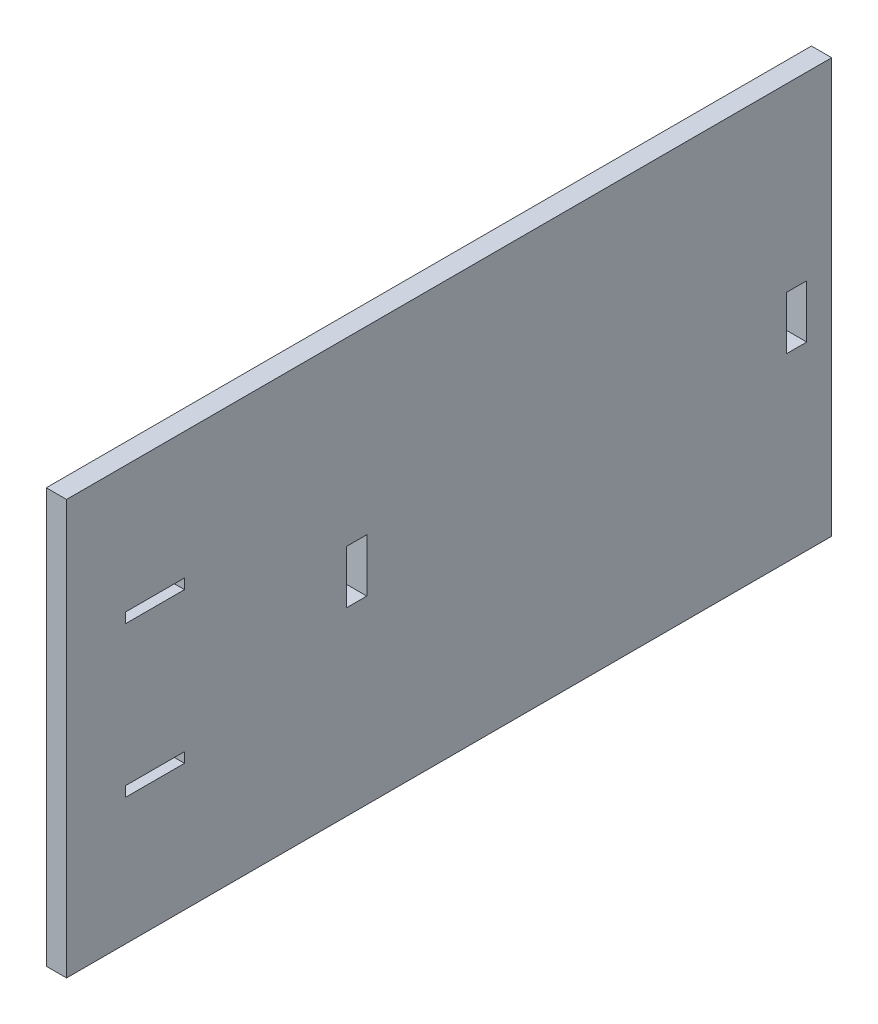
ISO-10303-21;
HEADER;
FILE_DESCRIPTION(('STEP AP214'),'2;1');
FILE_NAME('part.step','',(''),(''),'','','');
FILE_SCHEMA(('AUTOMOTIVE_DESIGN { 1 0 10303 214 1 1 1 1 }'));
ENDSEC;
DATA;
#1=APPLICATION_CONTEXT('core data for automotive mechanical design processes');
#2=APPLICATION_PROTOCOL_DEFINITION('international standard','automotive_design',2000,#1);
#3=PRODUCT_CONTEXT('',#1,'mechanical');
#4=PRODUCT('Part','Part','',(#3));
#5=PRODUCT_RELATED_PRODUCT_CATEGORY('part','',(#4));
#6=PRODUCT_DEFINITION_FORMATION('','',#4);
#7=PRODUCT_DEFINITION_CONTEXT('part definition',#1,'design');
#8=PRODUCT_DEFINITION('design','',#6,#7);
#9=PRODUCT_DEFINITION_SHAPE('','',#8);
#10=(LENGTH_UNIT() NAMED_UNIT(*) SI_UNIT(.MILLI.,.METRE.));
#11=(NAMED_UNIT(*) PLANE_ANGLE_UNIT() SI_UNIT($,.RADIAN.));
#12=(NAMED_UNIT(*) SI_UNIT($,.STERADIAN.) SOLID_ANGLE_UNIT());
#13=UNCERTAINTY_MEASURE_WITH_UNIT(LENGTH_MEASURE(1.E-05),#10,'distance_accuracy_value','');
#14=(GEOMETRIC_REPRESENTATION_CONTEXT(3) GLOBAL_UNCERTAINTY_ASSIGNED_CONTEXT((#13)) GLOBAL_UNIT_ASSIGNED_CONTEXT((#10,
#11,#12)) REPRESENTATION_CONTEXT('',''));
#15=CARTESIAN_POINT('',(0.,0.,0.));
#16=DIRECTION('',(0.,0.,1.));
#17=DIRECTION('',(1.,0.,0.));
#18=AXIS2_PLACEMENT_3D('',#15,#16,#17);
#19=CARTESIAN_POINT('',(6.35,0.,0.));
#20=DIRECTION('',(-1.,0.,0.));
#21=DIRECTION('',(0.,0.,1.));
#22=AXIS2_PLACEMENT_3D('',#19,#20,#21);
#23=PLANE('',#22);
#24=DIRECTION('',(0.,1.,0.));
#25=VECTOR('',#24,1.);
#26=CARTESIAN_POINT('',(6.35,73.3366666666667,-232.175));
#27=LINE('',#26,#25);
#28=CARTESIAN_POINT('',(6.35,56.67,-232.175));
#29=VERTEX_POINT('',#28);
#30=CARTESIAN_POINT('',(6.35,73.3366666666667,-232.175));
#31=VERTEX_POINT('',#30);
#32=EDGE_CURVE('E206',#29,#31,#27,.T.);
#33=ORIENTED_EDGE('',*,*,#32,.F.);
#34=DIRECTION('',(0.,0.,-1.));
#35=VECTOR('',#34,1.);
#36=CARTESIAN_POINT('',(6.35,56.67,-232.175));
#37=LINE('',#36,#35);
#38=CARTESIAN_POINT('',(6.35,56.67,-225.825));
#39=VERTEX_POINT('',#38);
#40=EDGE_CURVE('E214',#39,#29,#37,.T.);
#41=ORIENTED_EDGE('',*,*,#40,.F.);
#42=DIRECTION('',(0.,-1.,0.));
#43=VECTOR('',#42,1.);
#44=CARTESIAN_POINT('',(6.35,73.3366666666667,-225.825));
#45=LINE('',#44,#43);
#46=CARTESIAN_POINT('',(6.35,73.3366666666667,-225.825));
#47=VERTEX_POINT('',#46);
#48=EDGE_CURVE('E211',#47,#39,#45,.T.);
#49=ORIENTED_EDGE('',*,*,#48,.F.);
#50=DIRECTION('',(0.,0.,1.));
#51=VECTOR('',#50,1.);
#52=CARTESIAN_POINT('',(6.35,73.3366666666667,-232.175));
#53=LINE('',#52,#51);
#54=EDGE_CURVE('E208',#31,#47,#53,.T.);
#55=ORIENTED_EDGE('',*,*,#54,.F.);
#56=EDGE_LOOP('',(#33,#41,#49,#55));
#57=FACE_BOUND('',#56,.T.);
#58=DIRECTION('',(0.,1.,0.));
#59=VECTOR('',#58,1.);
#60=CARTESIAN_POINT('',(6.35,73.33,-94.1749999999999));
#61=LINE('',#60,#59);
#62=CARTESIAN_POINT('',(6.35,56.6633333333333,-94.1749999999999));
#63=VERTEX_POINT('',#62);
#64=CARTESIAN_POINT('',(6.35,73.33,-94.1749999999999));
#65=VERTEX_POINT('',#64);
#66=EDGE_CURVE('E268',#63,#65,#61,.T.);
#67=ORIENTED_EDGE('',*,*,#66,.F.);
#68=DIRECTION('',(0.,0.,-1.));
#69=VECTOR('',#68,1.);
#70=CARTESIAN_POINT('',(6.35,56.6633333333333,-94.1749999999999));
#71=LINE('',#70,#69);
#72=CARTESIAN_POINT('',(6.35,56.6633333333333,-87.8249999999999));
#73=VERTEX_POINT('',#72);
#74=EDGE_CURVE('E276',#73,#63,#71,.T.);
#75=ORIENTED_EDGE('',*,*,#74,.F.);
#76=DIRECTION('',(0.,-1.,0.));
#77=VECTOR('',#76,1.);
#78=CARTESIAN_POINT('',(6.35,73.33,-87.8249999999999));
#79=LINE('',#78,#77);
#80=CARTESIAN_POINT('',(6.35,73.33,-87.8249999999999));
#81=VERTEX_POINT('',#80);
#82=EDGE_CURVE('E273',#81,#73,#79,.T.);
#83=ORIENTED_EDGE('',*,*,#82,.F.);
#84=DIRECTION('',(0.,0.,1.));
#85=VECTOR('',#84,1.);
#86=CARTESIAN_POINT('',(6.35,73.33,-94.1749999999999));
#87=LINE('',#86,#85);
#88=EDGE_CURVE('E270',#65,#81,#87,.T.);
#89=ORIENTED_EDGE('',*,*,#88,.F.);
#90=EDGE_LOOP('',(#67,#75,#83,#89));
#91=FACE_BOUND('',#90,.T.);
#92=DIRECTION('',(0.,-1.,0.));
#93=VECTOR('',#92,1.);
#94=CARTESIAN_POINT('',(6.35,0.,0.));
#95=LINE('',#94,#93);
#96=CARTESIAN_POINT('',(6.35,130.,0.));
#97=VERTEX_POINT('',#96);
#98=CARTESIAN_POINT('',(6.35,0.,0.));
#99=VERTEX_POINT('',#98);
#100=EDGE_CURVE('E299',#97,#99,#95,.T.);
#101=ORIENTED_EDGE('',*,*,#100,.T.);
#102=DIRECTION('',(0.,0.,-1.));
#103=VECTOR('',#102,1.);
#104=CARTESIAN_POINT('',(6.35,0.,0.));
#105=LINE('',#104,#103);
#106=CARTESIAN_POINT('',(6.35,0.,-240.));
#107=VERTEX_POINT('',#106);
#108=EDGE_CURVE('E302',#99,#107,#105,.T.);
#109=ORIENTED_EDGE('',*,*,#108,.T.);
#110=DIRECTION('',(0.,1.,0.));
#111=VECTOR('',#110,1.);
#112=CARTESIAN_POINT('',(6.35,0.,-240.));
#113=LINE('',#112,#111);
#114=CARTESIAN_POINT('',(6.35,130.,-240.));
#115=VERTEX_POINT('',#114);
#116=EDGE_CURVE('E305',#107,#115,#113,.T.);
#117=ORIENTED_EDGE('',*,*,#116,.T.);
#118=DIRECTION('',(0.,0.,1.));
#119=VECTOR('',#118,1.);
#120=CARTESIAN_POINT('',(6.35,130.,0.));
#121=LINE('',#120,#119);
#122=EDGE_CURVE('E307',#115,#97,#121,.T.);
#123=ORIENTED_EDGE('',*,*,#122,.T.);
#124=EDGE_LOOP('',(#101,#109,#117,#123));
#125=FACE_BOUND('',#124,.T.);
#126=DIRECTION('',(0.,1.,0.));
#127=VECTOR('',#126,1.);
#128=CARTESIAN_POINT('',(6.35,87.,-37.));
#129=LINE('',#128,#127);
#130=CARTESIAN_POINT('',(6.35,87.,-37.));
#131=VERTEX_POINT('',#130);
#132=CARTESIAN_POINT('',(6.35,90.175,-37.));
#133=VERTEX_POINT('',#132);
#134=EDGE_CURVE('E237',#131,#133,#129,.T.);
#135=ORIENTED_EDGE('',*,*,#134,.F.);
#136=DIRECTION('',(0.,0.,-1.));
#137=VECTOR('',#136,1.);
#138=CARTESIAN_POINT('',(6.35,87.,-37.));
#139=LINE('',#138,#137);
#140=CARTESIAN_POINT('',(6.35,87.,-18.5));
#141=VERTEX_POINT('',#140);
#142=EDGE_CURVE('E245',#141,#131,#139,.T.);
#143=ORIENTED_EDGE('',*,*,#142,.F.);
#144=DIRECTION('',(0.,-1.,0.));
#145=VECTOR('',#144,1.);
#146=CARTESIAN_POINT('',(6.35,87.,-18.5));
#147=LINE('',#146,#145);
#148=CARTESIAN_POINT('',(6.35,90.175,-18.5));
#149=VERTEX_POINT('',#148);
#150=EDGE_CURVE('E242',#149,#141,#147,.T.);
#151=ORIENTED_EDGE('',*,*,#150,.F.);
#152=DIRECTION('',(0.,0.,1.));
#153=VECTOR('',#152,1.);
#154=CARTESIAN_POINT('',(6.35,90.175,-37.));
#155=LINE('',#154,#153);
#156=EDGE_CURVE('E239',#133,#149,#155,.T.);
#157=ORIENTED_EDGE('',*,*,#156,.F.);
#158=EDGE_LOOP('',(#135,#143,#151,#157));
#159=FACE_BOUND('',#158,.T.);
#160=DIRECTION('',(0.,1.,0.));
#161=VECTOR('',#160,1.);
#162=CARTESIAN_POINT('',(6.35,43.,-37.));
#163=LINE('',#162,#161);
#164=CARTESIAN_POINT('',(6.35,39.825,-37.));
#165=VERTEX_POINT('',#164);
#166=CARTESIAN_POINT('',(6.35,43.,-37.));
#167=VERTEX_POINT('',#166);
#168=EDGE_CURVE('E170',#165,#167,#163,.T.);
#169=ORIENTED_EDGE('',*,*,#168,.F.);
#170=DIRECTION('',(0.,0.,-1.));
#171=VECTOR('',#170,1.);
#172=CARTESIAN_POINT('',(6.35,39.825,-37.));
#173=LINE('',#172,#171);
#174=CARTESIAN_POINT('',(6.35,39.825,-18.5));
#175=VERTEX_POINT('',#174);
#176=EDGE_CURVE('E192',#175,#165,#173,.T.);
#177=ORIENTED_EDGE('',*,*,#176,.F.);
#178=DIRECTION('',(0.,-1.,0.));
#179=VECTOR('',#178,1.);
#180=CARTESIAN_POINT('',(6.35,43.,-18.5));
#181=LINE('',#180,#179);
#182=CARTESIAN_POINT('',(6.35,43.,-18.5));
#183=VERTEX_POINT('',#182);
#184=EDGE_CURVE('E190',#183,#175,#181,.T.);
#185=ORIENTED_EDGE('',*,*,#184,.F.);
#186=DIRECTION('',(0.,0.,1.));
#187=VECTOR('',#186,1.);
#188=CARTESIAN_POINT('',(6.35,43.,-37.));
#189=LINE('',#188,#187);
#190=EDGE_CURVE('E178',#167,#183,#189,.T.);
#191=ORIENTED_EDGE('',*,*,#190,.F.);
#192=EDGE_LOOP('',(#169,#177,#185,#191));
#193=FACE_BOUND('',#192,.T.);
#194=ADVANCED_FACE('F33',(#57,#91,#125,#159,#193),#23,.F.);
#195=CARTESIAN_POINT('',(0.,0.,0.));
#196=DIRECTION('',(-1.,0.,0.));
#197=DIRECTION('',(0.,0.,1.));
#198=AXIS2_PLACEMENT_3D('',#195,#196,#197);
#199=PLANE('',#198);
#200=DIRECTION('',(0.,-1.,0.));
#201=VECTOR('',#200,1.);
#202=CARTESIAN_POINT('',(0.,0.,0.));
#203=LINE('',#202,#201);
#204=CARTESIAN_POINT('',(0.,130.,0.));
#205=VERTEX_POINT('',#204);
#206=CARTESIAN_POINT('',(0.,0.,0.));
#207=VERTEX_POINT('',#206);
#208=EDGE_CURVE('E298',#205,#207,#203,.T.);
#209=ORIENTED_EDGE('',*,*,#208,.F.);
#210=DIRECTION('',(0.,0.,1.));
#211=VECTOR('',#210,1.);
#212=CARTESIAN_POINT('',(0.,130.,0.));
#213=LINE('',#212,#211);
#214=CARTESIAN_POINT('',(0.,130.,-240.));
#215=VERTEX_POINT('',#214);
#216=EDGE_CURVE('E303',#215,#205,#213,.T.);
#217=ORIENTED_EDGE('',*,*,#216,.F.);
#218=DIRECTION('',(0.,1.,0.));
#219=VECTOR('',#218,1.);
#220=CARTESIAN_POINT('',(0.,0.,-240.));
#221=LINE('',#220,#219);
#222=CARTESIAN_POINT('',(0.,0.,-240.));
#223=VERTEX_POINT('',#222);
#224=EDGE_CURVE('E314',#223,#215,#221,.T.);
#225=ORIENTED_EDGE('',*,*,#224,.F.);
#226=DIRECTION('',(0.,0.,-1.));
#227=VECTOR('',#226,1.);
#228=CARTESIAN_POINT('',(0.,0.,0.));
#229=LINE('',#228,#227);
#230=EDGE_CURVE('E312',#207,#223,#229,.T.);
#231=ORIENTED_EDGE('',*,*,#230,.F.);
#232=EDGE_LOOP('',(#209,#217,#225,#231));
#233=FACE_BOUND('',#232,.T.);
#234=DIRECTION('',(0.,0.,-1.));
#235=VECTOR('',#234,1.);
#236=CARTESIAN_POINT('',(0.,56.6633333333333,-94.1749999999999));
#237=LINE('',#236,#235);
#238=CARTESIAN_POINT('',(0.,56.6633333333333,-87.8249999999999));
#239=VERTEX_POINT('',#238);
#240=CARTESIAN_POINT('',(0.,56.6633333333333,-94.1749999999999));
#241=VERTEX_POINT('',#240);
#242=EDGE_CURVE('E271',#239,#241,#237,.T.);
#243=ORIENTED_EDGE('',*,*,#242,.T.);
#244=DIRECTION('',(0.,1.,0.));
#245=VECTOR('',#244,1.);
#246=CARTESIAN_POINT('',(0.,73.33,-94.1749999999999));
#247=LINE('',#246,#245);
#248=CARTESIAN_POINT('',(0.,73.33,-94.1749999999999));
#249=VERTEX_POINT('',#248);
#250=EDGE_CURVE('E267',#241,#249,#247,.T.);
#251=ORIENTED_EDGE('',*,*,#250,.T.);
#252=DIRECTION('',(0.,0.,1.));
#253=VECTOR('',#252,1.);
#254=CARTESIAN_POINT('',(0.,73.33,-94.1749999999999));
#255=LINE('',#254,#253);
#256=CARTESIAN_POINT('',(0.,73.33,-87.8249999999999));
#257=VERTEX_POINT('',#256);
#258=EDGE_CURVE('E281',#249,#257,#255,.T.);
#259=ORIENTED_EDGE('',*,*,#258,.T.);
#260=DIRECTION('',(0.,-1.,0.));
#261=VECTOR('',#260,1.);
#262=CARTESIAN_POINT('',(0.,73.33,-87.8249999999999));
#263=LINE('',#262,#261);
#264=EDGE_CURVE('E284',#257,#239,#263,.T.);
#265=ORIENTED_EDGE('',*,*,#264,.T.);
#266=EDGE_LOOP('',(#243,#251,#259,#265));
#267=FACE_BOUND('',#266,.T.);
#268=DIRECTION('',(0.,0.,-1.));
#269=VECTOR('',#268,1.);
#270=CARTESIAN_POINT('',(0.,87.,-37.));
#271=LINE('',#270,#269);
#272=CARTESIAN_POINT('',(0.,87.,-18.5));
#273=VERTEX_POINT('',#272);
#274=CARTESIAN_POINT('',(0.,87.,-37.));
#275=VERTEX_POINT('',#274);
#276=EDGE_CURVE('E240',#273,#275,#271,.T.);
#277=ORIENTED_EDGE('',*,*,#276,.T.);
#278=DIRECTION('',(0.,1.,0.));
#279=VECTOR('',#278,1.);
#280=CARTESIAN_POINT('',(0.,87.,-37.));
#281=LINE('',#280,#279);
#282=CARTESIAN_POINT('',(0.,90.175,-37.));
#283=VERTEX_POINT('',#282);
#284=EDGE_CURVE('E236',#275,#283,#281,.T.);
#285=ORIENTED_EDGE('',*,*,#284,.T.);
#286=DIRECTION('',(0.,0.,1.));
#287=VECTOR('',#286,1.);
#288=CARTESIAN_POINT('',(0.,90.175,-37.));
#289=LINE('',#288,#287);
#290=CARTESIAN_POINT('',(0.,90.175,-18.5));
#291=VERTEX_POINT('',#290);
#292=EDGE_CURVE('E250',#283,#291,#289,.T.);
#293=ORIENTED_EDGE('',*,*,#292,.T.);
#294=DIRECTION('',(0.,-1.,0.));
#295=VECTOR('',#294,1.);
#296=CARTESIAN_POINT('',(0.,87.,-18.5));
#297=LINE('',#296,#295);
#298=EDGE_CURVE('E253',#291,#273,#297,.T.);
#299=ORIENTED_EDGE('',*,*,#298,.T.);
#300=EDGE_LOOP('',(#277,#285,#293,#299));
#301=FACE_BOUND('',#300,.T.);
#302=DIRECTION('',(0.,0.,-1.));
#303=VECTOR('',#302,1.);
#304=CARTESIAN_POINT('',(0.,56.67,-232.175));
#305=LINE('',#304,#303);
#306=CARTESIAN_POINT('',(0.,56.67,-225.825));
#307=VERTEX_POINT('',#306);
#308=CARTESIAN_POINT('',(0.,56.67,-232.175));
#309=VERTEX_POINT('',#308);
#310=EDGE_CURVE('E209',#307,#309,#305,.T.);
#311=ORIENTED_EDGE('',*,*,#310,.T.);
#312=DIRECTION('',(0.,1.,0.));
#313=VECTOR('',#312,1.);
#314=CARTESIAN_POINT('',(0.,73.3366666666667,-232.175));
#315=LINE('',#314,#313);
#316=CARTESIAN_POINT('',(0.,73.3366666666667,-232.175));
#317=VERTEX_POINT('',#316);
#318=EDGE_CURVE('E186',#309,#317,#315,.T.);
#319=ORIENTED_EDGE('',*,*,#318,.T.);
#320=DIRECTION('',(0.,0.,1.));
#321=VECTOR('',#320,1.);
#322=CARTESIAN_POINT('',(0.,73.3366666666667,-232.175));
#323=LINE('',#322,#321);
#324=CARTESIAN_POINT('',(0.,73.3366666666667,-225.825));
#325=VERTEX_POINT('',#324);
#326=EDGE_CURVE('E219',#317,#325,#323,.T.);
#327=ORIENTED_EDGE('',*,*,#326,.T.);
#328=DIRECTION('',(0.,-1.,0.));
#329=VECTOR('',#328,1.);
#330=CARTESIAN_POINT('',(0.,73.3366666666667,-225.825));
#331=LINE('',#330,#329);
#332=EDGE_CURVE('E222',#325,#307,#331,.T.);
#333=ORIENTED_EDGE('',*,*,#332,.T.);
#334=EDGE_LOOP('',(#311,#319,#327,#333));
#335=FACE_BOUND('',#334,.T.);
#336=DIRECTION('',(0.,0.,-1.));
#337=VECTOR('',#336,1.);
#338=CARTESIAN_POINT('',(0.,39.825,-37.));
#339=LINE('',#338,#337);
#340=CARTESIAN_POINT('',(0.,39.825,-18.5));
#341=VERTEX_POINT('',#340);
#342=CARTESIAN_POINT('',(0.,39.825,-37.));
#343=VERTEX_POINT('',#342);
#344=EDGE_CURVE('E179',#341,#343,#339,.T.);
#345=ORIENTED_EDGE('',*,*,#344,.T.);
#346=DIRECTION('',(0.,1.,0.));
#347=VECTOR('',#346,1.);
#348=CARTESIAN_POINT('',(0.,43.,-37.));
#349=LINE('',#348,#347);
#350=CARTESIAN_POINT('',(0.,43.,-37.));
#351=VERTEX_POINT('',#350);
#352=EDGE_CURVE('E56',#343,#351,#349,.T.);
#353=ORIENTED_EDGE('',*,*,#352,.T.);
#354=DIRECTION('',(0.,0.,1.));
#355=VECTOR('',#354,1.);
#356=CARTESIAN_POINT('',(0.,43.,-37.));
#357=LINE('',#356,#355);
#358=CARTESIAN_POINT('',(0.,43.,-18.5));
#359=VERTEX_POINT('',#358);
#360=EDGE_CURVE('E185',#351,#359,#357,.T.);
#361=ORIENTED_EDGE('',*,*,#360,.T.);
#362=DIRECTION('',(0.,-1.,0.));
#363=VECTOR('',#362,1.);
#364=CARTESIAN_POINT('',(0.,43.,-18.5));
#365=LINE('',#364,#363);
#366=EDGE_CURVE('E198',#359,#341,#365,.T.);
#367=ORIENTED_EDGE('',*,*,#366,.T.);
#368=EDGE_LOOP('',(#345,#353,#361,#367));
#369=FACE_BOUND('',#368,.T.);
#370=ADVANCED_FACE('F332',(#233,#267,#301,#335,#369),#199,.T.);
#371=CARTESIAN_POINT('',(6.35,0.,0.));
#372=DIRECTION('',(0.,0.,-1.));
#373=DIRECTION('',(-1.,0.,0.));
#374=AXIS2_PLACEMENT_3D('',#371,#372,#373);
#375=PLANE('',#374);
#376=ORIENTED_EDGE('',*,*,#208,.T.);
#377=DIRECTION('',(-1.,0.,0.));
#378=VECTOR('',#377,1.);
#379=CARTESIAN_POINT('',(6.35,0.,0.));
#380=LINE('',#379,#378);
#381=EDGE_CURVE('E11',#99,#207,#380,.T.);
#382=ORIENTED_EDGE('',*,*,#381,.F.);
#383=ORIENTED_EDGE('',*,*,#100,.F.);
#384=DIRECTION('',(-1.,0.,0.));
#385=VECTOR('',#384,1.);
#386=CARTESIAN_POINT('',(6.35,130.,0.));
#387=LINE('',#386,#385);
#388=EDGE_CURVE('E309',#97,#205,#387,.T.);
#389=ORIENTED_EDGE('',*,*,#388,.T.);
#390=EDGE_LOOP('',(#376,#382,#383,#389));
#391=FACE_BOUND('',#390,.T.);
#392=ADVANCED_FACE('F35',(#391),#375,.F.);
#393=CARTESIAN_POINT('',(6.35,0.,0.));
#394=DIRECTION('',(0.,1.,0.));
#395=DIRECTION('',(0.,0.,1.));
#396=AXIS2_PLACEMENT_3D('',#393,#394,#395);
#397=PLANE('',#396);
#398=ORIENTED_EDGE('',*,*,#230,.T.);
#399=DIRECTION('',(-1.,0.,0.));
#400=VECTOR('',#399,1.);
#401=CARTESIAN_POINT('',(6.35,0.,-240.));
#402=LINE('',#401,#400);
#403=EDGE_CURVE('E41',#107,#223,#402,.T.);
#404=ORIENTED_EDGE('',*,*,#403,.F.);
#405=ORIENTED_EDGE('',*,*,#108,.F.);
#406=ORIENTED_EDGE('',*,*,#381,.T.);
#407=EDGE_LOOP('',(#398,#404,#405,#406));
#408=FACE_BOUND('',#407,.T.);
#409=ADVANCED_FACE('F343',(#408),#397,.F.);
#410=CARTESIAN_POINT('',(6.35,0.,-240.));
#411=DIRECTION('',(0.,0.,1.));
#412=DIRECTION('',(1.,0.,0.));
#413=AXIS2_PLACEMENT_3D('',#410,#411,#412);
#414=PLANE('',#413);
#415=ORIENTED_EDGE('',*,*,#224,.T.);
#416=DIRECTION('',(-1.,0.,0.));
#417=VECTOR('',#416,1.);
#418=CARTESIAN_POINT('',(6.35,130.,-240.));
#419=LINE('',#418,#417);
#420=EDGE_CURVE('E319',#115,#215,#419,.T.);
#421=ORIENTED_EDGE('',*,*,#420,.F.);
#422=ORIENTED_EDGE('',*,*,#116,.F.);
#423=ORIENTED_EDGE('',*,*,#403,.T.);
#424=EDGE_LOOP('',(#415,#421,#422,#423));
#425=FACE_BOUND('',#424,.T.);
#426=ADVANCED_FACE('F326',(#425),#414,.F.);
#427=CARTESIAN_POINT('',(6.35,130.,0.));
#428=DIRECTION('',(0.,-1.,0.));
#429=DIRECTION('',(0.,0.,-1.));
#430=AXIS2_PLACEMENT_3D('',#427,#428,#429);
#431=PLANE('',#430);
#432=ORIENTED_EDGE('',*,*,#216,.T.);
#433=ORIENTED_EDGE('',*,*,#388,.F.);
#434=ORIENTED_EDGE('',*,*,#122,.F.);
#435=ORIENTED_EDGE('',*,*,#420,.T.);
#436=EDGE_LOOP('',(#432,#433,#434,#435));
#437=FACE_BOUND('',#436,.T.);
#438=ADVANCED_FACE('F336',(#437),#431,.F.);
#439=CARTESIAN_POINT('',(6.35,73.33,-94.1749999999999));
#440=DIRECTION('',(0.,0.,1.));
#441=DIRECTION('',(1.,0.,0.));
#442=AXIS2_PLACEMENT_3D('',#439,#440,#441);
#443=PLANE('',#442);
#444=ORIENTED_EDGE('',*,*,#250,.F.);
#445=DIRECTION('',(-1.,0.,0.));
#446=VECTOR('',#445,1.);
#447=CARTESIAN_POINT('',(6.35,56.6633333333333,-94.1749999999999));
#448=LINE('',#447,#446);
#449=EDGE_CURVE('E278',#63,#241,#448,.T.);
#450=ORIENTED_EDGE('',*,*,#449,.F.);
#451=ORIENTED_EDGE('',*,*,#66,.T.);
#452=DIRECTION('',(-1.,0.,0.));
#453=VECTOR('',#452,1.);
#454=CARTESIAN_POINT('',(6.35,73.33,-94.1749999999999));
#455=LINE('',#454,#453);
#456=EDGE_CURVE('E295',#65,#249,#455,.T.);
#457=ORIENTED_EDGE('',*,*,#456,.T.);
#458=EDGE_LOOP('',(#444,#450,#451,#457));
#459=FACE_BOUND('',#458,.T.);
#460=ADVANCED_FACE('F360',(#459),#443,.T.);
#461=CARTESIAN_POINT('',(6.35,73.33,-94.1749999999999));
#462=DIRECTION('',(0.,-1.,0.));
#463=DIRECTION('',(0.,0.,-1.));
#464=AXIS2_PLACEMENT_3D('',#461,#462,#463);
#465=PLANE('',#464);
#466=ORIENTED_EDGE('',*,*,#258,.F.);
#467=ORIENTED_EDGE('',*,*,#456,.F.);
#468=ORIENTED_EDGE('',*,*,#88,.T.);
#469=DIRECTION('',(-1.,0.,0.));
#470=VECTOR('',#469,1.);
#471=CARTESIAN_POINT('',(6.35,73.33,-87.8249999999999));
#472=LINE('',#471,#470);
#473=EDGE_CURVE('E293',#81,#257,#472,.T.);
#474=ORIENTED_EDGE('',*,*,#473,.T.);
#475=EDGE_LOOP('',(#466,#467,#468,#474));
#476=FACE_BOUND('',#475,.T.);
#477=ADVANCED_FACE('F367',(#476),#465,.T.);
#478=CARTESIAN_POINT('',(6.35,73.33,-87.8249999999999));
#479=DIRECTION('',(0.,0.,-1.));
#480=DIRECTION('',(-1.,0.,0.));
#481=AXIS2_PLACEMENT_3D('',#478,#479,#480);
#482=PLANE('',#481);
#483=ORIENTED_EDGE('',*,*,#264,.F.);
#484=ORIENTED_EDGE('',*,*,#473,.F.);
#485=ORIENTED_EDGE('',*,*,#82,.T.);
#486=DIRECTION('',(-1.,0.,0.));
#487=VECTOR('',#486,1.);
#488=CARTESIAN_POINT('',(6.35,56.6633333333333,-87.8249999999999));
#489=LINE('',#488,#487);
#490=EDGE_CURVE('E291',#73,#239,#489,.T.);
#491=ORIENTED_EDGE('',*,*,#490,.T.);
#492=EDGE_LOOP('',(#483,#484,#485,#491));
#493=FACE_BOUND('',#492,.T.);
#494=ADVANCED_FACE('F372',(#493),#482,.T.);
#495=CARTESIAN_POINT('',(6.35,56.6633333333333,-94.1749999999999));
#496=DIRECTION('',(0.,1.,0.));
#497=DIRECTION('',(0.,0.,1.));
#498=AXIS2_PLACEMENT_3D('',#495,#496,#497);
#499=PLANE('',#498);
#500=ORIENTED_EDGE('',*,*,#242,.F.);
#501=ORIENTED_EDGE('',*,*,#490,.F.);
#502=ORIENTED_EDGE('',*,*,#74,.T.);
#503=ORIENTED_EDGE('',*,*,#449,.T.);
#504=EDGE_LOOP('',(#500,#501,#502,#503));
#505=FACE_BOUND('',#504,.T.);
#506=ADVANCED_FACE('F379',(#505),#499,.T.);
#507=CARTESIAN_POINT('',(6.35,87.,-37.));
#508=DIRECTION('',(0.,0.,1.));
#509=DIRECTION('',(0.,-1.,0.));
#510=AXIS2_PLACEMENT_3D('',#507,#508,#509);
#511=PLANE('',#510);
#512=ORIENTED_EDGE('',*,*,#284,.F.);
#513=DIRECTION('',(-1.,0.,0.));
#514=VECTOR('',#513,1.);
#515=CARTESIAN_POINT('',(6.35,87.,-37.));
#516=LINE('',#515,#514);
#517=EDGE_CURVE('E247',#131,#275,#516,.T.);
#518=ORIENTED_EDGE('',*,*,#517,.F.);
#519=ORIENTED_EDGE('',*,*,#134,.T.);
#520=DIRECTION('',(-1.,0.,0.));
#521=VECTOR('',#520,1.);
#522=CARTESIAN_POINT('',(6.35,90.175,-37.));
#523=LINE('',#522,#521);
#524=EDGE_CURVE('E264',#133,#283,#523,.T.);
#525=ORIENTED_EDGE('',*,*,#524,.T.);
#526=EDGE_LOOP('',(#512,#518,#519,#525));
#527=FACE_BOUND('',#526,.T.);
#528=ADVANCED_FACE('F392',(#527),#511,.T.);
#529=CARTESIAN_POINT('',(6.35,90.175,-37.));
#530=DIRECTION('',(0.,-1.,0.));
#531=DIRECTION('',(0.,0.,-1.));
#532=AXIS2_PLACEMENT_3D('',#529,#530,#531);
#533=PLANE('',#532);
#534=ORIENTED_EDGE('',*,*,#292,.F.);
#535=ORIENTED_EDGE('',*,*,#524,.F.);
#536=ORIENTED_EDGE('',*,*,#156,.T.);
#537=DIRECTION('',(-1.,0.,0.));
#538=VECTOR('',#537,1.);
#539=CARTESIAN_POINT('',(6.35,90.175,-18.5));
#540=LINE('',#539,#538);
#541=EDGE_CURVE('E262',#149,#291,#540,.T.);
#542=ORIENTED_EDGE('',*,*,#541,.T.);
#543=EDGE_LOOP('',(#534,#535,#536,#542));
#544=FACE_BOUND('',#543,.T.);
#545=ADVANCED_FACE('F397',(#544),#533,.T.);
#546=CARTESIAN_POINT('',(6.35,87.,-18.5));
#547=DIRECTION('',(0.,0.,-1.));
#548=DIRECTION('',(-1.,0.,0.));
#549=AXIS2_PLACEMENT_3D('',#546,#547,#548);
#550=PLANE('',#549);
#551=ORIENTED_EDGE('',*,*,#298,.F.);
#552=ORIENTED_EDGE('',*,*,#541,.F.);
#553=ORIENTED_EDGE('',*,*,#150,.T.);
#554=DIRECTION('',(-1.,0.,0.));
#555=VECTOR('',#554,1.);
#556=CARTESIAN_POINT('',(6.35,87.,-18.5));
#557=LINE('',#556,#555);
#558=EDGE_CURVE('E260',#141,#273,#557,.T.);
#559=ORIENTED_EDGE('',*,*,#558,.T.);
#560=EDGE_LOOP('',(#551,#552,#553,#559));
#561=FACE_BOUND('',#560,.T.);
#562=ADVANCED_FACE('F401',(#561),#550,.T.);
#563=CARTESIAN_POINT('',(6.35,87.,-37.));
#564=DIRECTION('',(0.,1.,0.));
#565=DIRECTION('',(0.,0.,1.));
#566=AXIS2_PLACEMENT_3D('',#563,#564,#565);
#567=PLANE('',#566);
#568=ORIENTED_EDGE('',*,*,#276,.F.);
#569=ORIENTED_EDGE('',*,*,#558,.F.);
#570=ORIENTED_EDGE('',*,*,#142,.T.);
#571=ORIENTED_EDGE('',*,*,#517,.T.);
#572=EDGE_LOOP('',(#568,#569,#570,#571));
#573=FACE_BOUND('',#572,.T.);
#574=ADVANCED_FACE('F405',(#573),#567,.T.);
#575=CARTESIAN_POINT('',(6.35,73.3366666666667,-232.175));
#576=DIRECTION('',(0.,0.,1.));
#577=DIRECTION('',(1.,0.,0.));
#578=AXIS2_PLACEMENT_3D('',#575,#576,#577);
#579=PLANE('',#578);
#580=ORIENTED_EDGE('',*,*,#318,.F.);
#581=DIRECTION('',(-1.,0.,0.));
#582=VECTOR('',#581,1.);
#583=CARTESIAN_POINT('',(6.35,56.67,-232.175));
#584=LINE('',#583,#582);
#585=EDGE_CURVE('E216',#29,#309,#584,.T.);
#586=ORIENTED_EDGE('',*,*,#585,.F.);
#587=ORIENTED_EDGE('',*,*,#32,.T.);
#588=DIRECTION('',(-1.,0.,0.));
#589=VECTOR('',#588,1.);
#590=CARTESIAN_POINT('',(6.35,73.3366666666667,-232.175));
#591=LINE('',#590,#589);
#592=EDGE_CURVE('E233',#31,#317,#591,.T.);
#593=ORIENTED_EDGE('',*,*,#592,.T.);
#594=EDGE_LOOP('',(#580,#586,#587,#593));
#595=FACE_BOUND('',#594,.T.);
#596=ADVANCED_FACE('F409',(#595),#579,.T.);
#597=CARTESIAN_POINT('',(6.35,73.3366666666667,-232.175));
#598=DIRECTION('',(0.,-1.,0.));
#599=DIRECTION('',(0.,0.,-1.));
#600=AXIS2_PLACEMENT_3D('',#597,#598,#599);
#601=PLANE('',#600);
#602=ORIENTED_EDGE('',*,*,#326,.F.);
#603=ORIENTED_EDGE('',*,*,#592,.F.);
#604=ORIENTED_EDGE('',*,*,#54,.T.);
#605=DIRECTION('',(-1.,0.,0.));
#606=VECTOR('',#605,1.);
#607=CARTESIAN_POINT('',(6.35,73.3366666666667,-225.825));
#608=LINE('',#607,#606);
#609=EDGE_CURVE('E231',#47,#325,#608,.T.);
#610=ORIENTED_EDGE('',*,*,#609,.T.);
#611=EDGE_LOOP('',(#602,#603,#604,#610));
#612=FACE_BOUND('',#611,.T.);
#613=ADVANCED_FACE('F413',(#612),#601,.T.);
#614=CARTESIAN_POINT('',(6.35,73.3366666666667,-225.825));
#615=DIRECTION('',(0.,0.,-1.));
#616=DIRECTION('',(-1.,0.,0.));
#617=AXIS2_PLACEMENT_3D('',#614,#615,#616);
#618=PLANE('',#617);
#619=ORIENTED_EDGE('',*,*,#332,.F.);
#620=ORIENTED_EDGE('',*,*,#609,.F.);
#621=ORIENTED_EDGE('',*,*,#48,.T.);
#622=DIRECTION('',(-1.,0.,0.));
#623=VECTOR('',#622,1.);
#624=CARTESIAN_POINT('',(6.35,56.67,-225.825));
#625=LINE('',#624,#623);
#626=EDGE_CURVE('E229',#39,#307,#625,.T.);
#627=ORIENTED_EDGE('',*,*,#626,.T.);
#628=EDGE_LOOP('',(#619,#620,#621,#627));
#629=FACE_BOUND('',#628,.T.);
#630=ADVANCED_FACE('F417',(#629),#618,.T.);
#631=CARTESIAN_POINT('',(6.35,56.67,-232.175));
#632=DIRECTION('',(0.,1.,0.));
#633=DIRECTION('',(0.,0.,1.));
#634=AXIS2_PLACEMENT_3D('',#631,#632,#633);
#635=PLANE('',#634);
#636=ORIENTED_EDGE('',*,*,#310,.F.);
#637=ORIENTED_EDGE('',*,*,#626,.F.);
#638=ORIENTED_EDGE('',*,*,#40,.T.);
#639=ORIENTED_EDGE('',*,*,#585,.T.);
#640=EDGE_LOOP('',(#636,#637,#638,#639));
#641=FACE_BOUND('',#640,.T.);
#642=ADVANCED_FACE('F421',(#641),#635,.T.);
#643=CARTESIAN_POINT('',(6.35,43.,-37.));
#644=DIRECTION('',(0.,0.,1.));
#645=DIRECTION('',(1.,0.,0.));
#646=AXIS2_PLACEMENT_3D('',#643,#644,#645);
#647=PLANE('',#646);
#648=ORIENTED_EDGE('',*,*,#352,.F.);
#649=DIRECTION('',(-1.,0.,0.));
#650=VECTOR('',#649,1.);
#651=CARTESIAN_POINT('',(6.35,39.825,-37.));
#652=LINE('',#651,#650);
#653=EDGE_CURVE('E174',#165,#343,#652,.T.);
#654=ORIENTED_EDGE('',*,*,#653,.F.);
#655=ORIENTED_EDGE('',*,*,#168,.T.);
#656=DIRECTION('',(-1.,0.,0.));
#657=VECTOR('',#656,1.);
#658=CARTESIAN_POINT('',(6.35,43.,-37.));
#659=LINE('',#658,#657);
#660=EDGE_CURVE('E173',#167,#351,#659,.T.);
#661=ORIENTED_EDGE('',*,*,#660,.T.);
#662=EDGE_LOOP('',(#648,#654,#655,#661));
#663=FACE_BOUND('',#662,.T.);
#664=ADVANCED_FACE('F172',(#663),#647,.T.);
#665=CARTESIAN_POINT('',(6.35,43.,-37.));
#666=DIRECTION('',(0.,-1.,0.));
#667=DIRECTION('',(0.,0.,-1.));
#668=AXIS2_PLACEMENT_3D('',#665,#666,#667);
#669=PLANE('',#668);
#670=ORIENTED_EDGE('',*,*,#360,.F.);
#671=ORIENTED_EDGE('',*,*,#660,.F.);
#672=ORIENTED_EDGE('',*,*,#190,.T.);
#673=DIRECTION('',(-1.,0.,0.));
#674=VECTOR('',#673,1.);
#675=CARTESIAN_POINT('',(6.35,43.,-18.5));
#676=LINE('',#675,#674);
#677=EDGE_CURVE('E187',#183,#359,#676,.T.);
#678=ORIENTED_EDGE('',*,*,#677,.T.);
#679=EDGE_LOOP('',(#670,#671,#672,#678));
#680=FACE_BOUND('',#679,.T.);
#681=ADVANCED_FACE('F182',(#680),#669,.T.);
#682=CARTESIAN_POINT('',(6.35,43.,-18.5));
#683=DIRECTION('',(0.,0.,-1.));
#684=DIRECTION('',(-1.,0.,0.));
#685=AXIS2_PLACEMENT_3D('',#682,#683,#684);
#686=PLANE('',#685);
#687=ORIENTED_EDGE('',*,*,#366,.F.);
#688=ORIENTED_EDGE('',*,*,#677,.F.);
#689=ORIENTED_EDGE('',*,*,#184,.T.);
#690=DIRECTION('',(-1.,0.,0.));
#691=VECTOR('',#690,1.);
#692=CARTESIAN_POINT('',(6.35,39.825,-18.5));
#693=LINE('',#692,#691);
#694=EDGE_CURVE('E48',#175,#341,#693,.T.);
#695=ORIENTED_EDGE('',*,*,#694,.T.);
#696=EDGE_LOOP('',(#687,#688,#689,#695));
#697=FACE_BOUND('',#696,.T.);
#698=ADVANCED_FACE('F430',(#697),#686,.T.);
#699=CARTESIAN_POINT('',(6.35,39.825,-37.));
#700=DIRECTION('',(0.,1.,0.));
#701=DIRECTION('',(0.,0.,1.));
#702=AXIS2_PLACEMENT_3D('',#699,#700,#701);
#703=PLANE('',#702);
#704=ORIENTED_EDGE('',*,*,#344,.F.);
#705=ORIENTED_EDGE('',*,*,#694,.F.);
#706=ORIENTED_EDGE('',*,*,#176,.T.);
#707=ORIENTED_EDGE('',*,*,#653,.T.);
#708=EDGE_LOOP('',(#704,#705,#706,#707));
#709=FACE_BOUND('',#708,.T.);
#710=ADVANCED_FACE('F433',(#709),#703,.T.);
#711=CLOSED_SHELL('',(#194,#370,#392,#409,#426,#438,#460,#477,#494,#506,#528,#545,#562,#574,
#596,#613,#630,#642,#664,#681,#698,#710));
#712=MANIFOLD_SOLID_BREP('B2',#711);
#713=ADVANCED_BREP_SHAPE_REPRESENTATION('',(#18,#712),#14);
#714=SHAPE_DEFINITION_REPRESENTATION(#9,#713);
ENDSEC;
END-ISO-10303-21;
